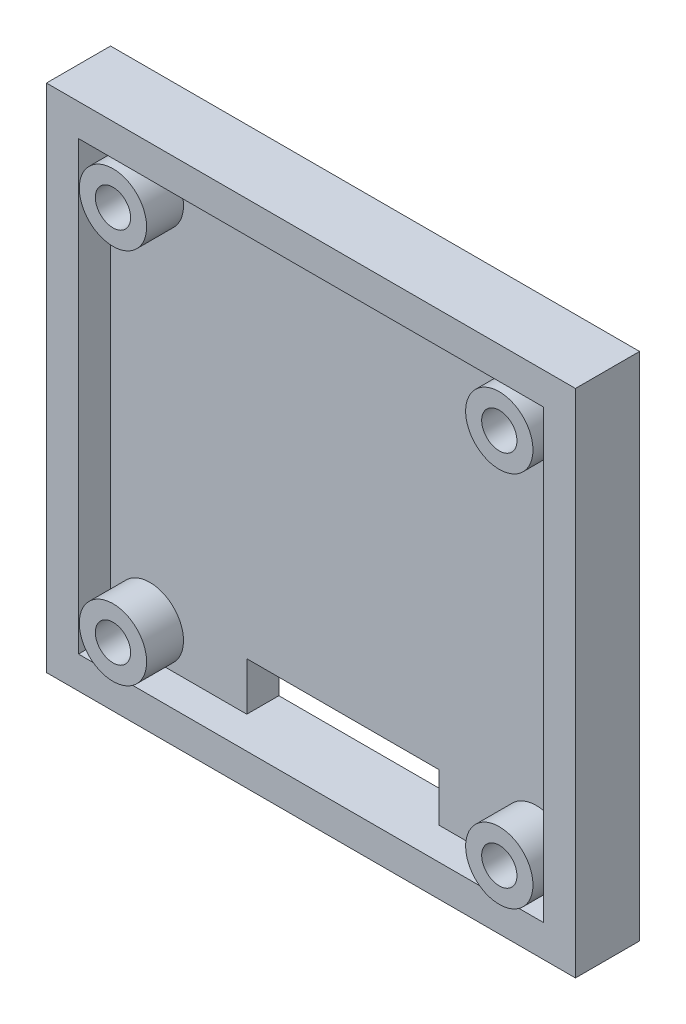
ISO-10303-21;
HEADER;
FILE_DESCRIPTION(('STEP AP214'),'2;1');
FILE_NAME('part.step','',(''),(''),'','','');
FILE_SCHEMA(('AUTOMOTIVE_DESIGN { 1 0 10303 214 1 1 1 1 }'));
ENDSEC;
DATA;
#1=APPLICATION_CONTEXT('core data for automotive mechanical design processes');
#2=APPLICATION_PROTOCOL_DEFINITION('international standard','automotive_design',2000,#1);
#3=PRODUCT_CONTEXT('',#1,'mechanical');
#4=PRODUCT('Part','Part','',(#3));
#5=PRODUCT_RELATED_PRODUCT_CATEGORY('part','',(#4));
#6=PRODUCT_DEFINITION_FORMATION('','',#4);
#7=PRODUCT_DEFINITION_CONTEXT('part definition',#1,'design');
#8=PRODUCT_DEFINITION('design','',#6,#7);
#9=PRODUCT_DEFINITION_SHAPE('','',#8);
#10=(LENGTH_UNIT() NAMED_UNIT(*) SI_UNIT(.MILLI.,.METRE.));
#11=(NAMED_UNIT(*) PLANE_ANGLE_UNIT() SI_UNIT($,.RADIAN.));
#12=(NAMED_UNIT(*) SI_UNIT($,.STERADIAN.) SOLID_ANGLE_UNIT());
#13=UNCERTAINTY_MEASURE_WITH_UNIT(LENGTH_MEASURE(1.E-05),#10,'distance_accuracy_value','');
#14=(GEOMETRIC_REPRESENTATION_CONTEXT(3) GLOBAL_UNCERTAINTY_ASSIGNED_CONTEXT((#13)) GLOBAL_UNIT_ASSIGNED_CONTEXT((#10,
#11,#12)) REPRESENTATION_CONTEXT('',''));
#15=CARTESIAN_POINT('',(0.,0.,0.));
#16=DIRECTION('',(0.,0.,1.));
#17=DIRECTION('',(1.,0.,0.));
#18=AXIS2_PLACEMENT_3D('',#15,#16,#17);
#19=CARTESIAN_POINT('',(0.,0.,2.));
#20=DIRECTION('',(0.,0.,1.));
#21=DIRECTION('',(1.,0.,0.));
#22=AXIS2_PLACEMENT_3D('',#19,#20,#21);
#23=PLANE('',#22);
#24=DIRECTION('',(1.,0.,0.));
#25=VECTOR('',#24,1.);
#26=CARTESIAN_POINT('',(-14.5,-13.925,2.));
#27=LINE('',#26,#25);
#28=CARTESIAN_POINT('',(6.,-13.925,2.));
#29=VERTEX_POINT('',#28);
#30=CARTESIAN_POINT('',(11.4096875762567,-13.925,2.));
#31=VERTEX_POINT('',#30);
#32=EDGE_CURVE('E443',#29,#31,#27,.T.);
#33=ORIENTED_EDGE('',*,*,#32,.T.);
#34=CARTESIAN_POINT('',(12.05,-11.925,2.));
#35=DIRECTION('',(0.,0.,1.));
#36=DIRECTION('',(1.,0.,0.));
#37=AXIS2_PLACEMENT_3D('',#34,#35,#36);
#38=CIRCLE('',#37,2.1);
#39=CARTESIAN_POINT('',(12.6903124237433,-13.925,2.));
#40=VERTEX_POINT('',#39);
#41=EDGE_CURVE('E290',#40,#31,#38,.T.);
#42=ORIENTED_EDGE('',*,*,#41,.F.);
#43=CARTESIAN_POINT('',(14.5,-13.925,2.));
#44=VERTEX_POINT('',#43);
#45=EDGE_CURVE('E228',#40,#44,#27,.T.);
#46=ORIENTED_EDGE('',*,*,#45,.T.);
#47=DIRECTION('',(0.,1.,0.));
#48=VECTOR('',#47,1.);
#49=CARTESIAN_POINT('',(14.5,13.925,2.));
#50=LINE('',#49,#48);
#51=CARTESIAN_POINT('',(14.5,13.925,2.));
#52=VERTEX_POINT('',#51);
#53=EDGE_CURVE('E233',#44,#52,#50,.T.);
#54=ORIENTED_EDGE('',*,*,#53,.T.);
#55=DIRECTION('',(-1.,0.,0.));
#56=VECTOR('',#55,1.);
#57=CARTESIAN_POINT('',(-14.5,13.925,2.));
#58=LINE('',#57,#56);
#59=CARTESIAN_POINT('',(-14.5,13.925,2.));
#60=VERTEX_POINT('',#59);
#61=EDGE_CURVE('E203',#52,#60,#58,.T.);
#62=ORIENTED_EDGE('',*,*,#61,.T.);
#63=DIRECTION('',(0.,-1.,0.));
#64=VECTOR('',#63,1.);
#65=CARTESIAN_POINT('',(-14.5,13.925,2.));
#66=LINE('',#65,#64);
#67=CARTESIAN_POINT('',(-14.5,-13.925,2.));
#68=VERTEX_POINT('',#67);
#69=EDGE_CURVE('E224',#60,#68,#66,.T.);
#70=ORIENTED_EDGE('',*,*,#69,.T.);
#71=CARTESIAN_POINT('',(-12.6903124237433,-13.925,2.));
#72=VERTEX_POINT('',#71);
#73=EDGE_CURVE('E229',#68,#72,#27,.T.);
#74=ORIENTED_EDGE('',*,*,#73,.T.);
#75=CARTESIAN_POINT('',(-12.05,-11.925,2.));
#76=DIRECTION('',(0.,0.,1.));
#77=DIRECTION('',(1.,0.,0.));
#78=AXIS2_PLACEMENT_3D('',#75,#76,#77);
#79=CIRCLE('',#78,2.1);
#80=CARTESIAN_POINT('',(-11.4096875762567,-13.925,2.));
#81=VERTEX_POINT('',#80);
#82=EDGE_CURVE('E301',#81,#72,#79,.T.);
#83=ORIENTED_EDGE('',*,*,#82,.F.);
#84=CARTESIAN_POINT('',(-6.,-13.925,2.));
#85=VERTEX_POINT('',#84);
#86=EDGE_CURVE('E234',#81,#85,#27,.T.);
#87=ORIENTED_EDGE('',*,*,#86,.T.);
#88=DIRECTION('',(0.,-1.,0.));
#89=VECTOR('',#88,1.);
#90=CARTESIAN_POINT('',(-6.,0.,2.));
#91=LINE('',#90,#89);
#92=CARTESIAN_POINT('',(-6.,-10.925,2.));
#93=VERTEX_POINT('',#92);
#94=EDGE_CURVE('E130',#93,#85,#91,.T.);
#95=ORIENTED_EDGE('',*,*,#94,.F.);
#96=DIRECTION('',(1.,0.,0.));
#97=VECTOR('',#96,1.);
#98=CARTESIAN_POINT('',(0.,-10.925,2.));
#99=LINE('',#98,#97);
#100=CARTESIAN_POINT('',(6.,-10.925,2.));
#101=VERTEX_POINT('',#100);
#102=EDGE_CURVE('E328',#93,#101,#99,.T.);
#103=ORIENTED_EDGE('',*,*,#102,.T.);
#104=DIRECTION('',(0.,-1.,0.));
#105=VECTOR('',#104,1.);
#106=CARTESIAN_POINT('',(6.,0.,2.));
#107=LINE('',#106,#105);
#108=EDGE_CURVE('E72',#101,#29,#107,.T.);
#109=ORIENTED_EDGE('',*,*,#108,.T.);
#110=EDGE_LOOP('',(#33,#42,#46,#54,#62,#70,#74,#83,#87,#95,#103,#109));
#111=FACE_BOUND('',#110,.T.);
#112=CARTESIAN_POINT('',(-12.05,11.575,2.));
#113=DIRECTION('',(0.,0.,1.));
#114=DIRECTION('',(1.,0.,0.));
#115=AXIS2_PLACEMENT_3D('',#112,#113,#114);
#116=CIRCLE('',#115,2.1);
#117=CARTESIAN_POINT('',(-9.95,11.575,2.));
#118=VERTEX_POINT('',#117);
#119=EDGE_CURVE('E316',#118,#118,#116,.T.);
#120=ORIENTED_EDGE('',*,*,#119,.F.);
#121=EDGE_LOOP('',(#120));
#122=FACE_BOUND('',#121,.T.);
#123=CARTESIAN_POINT('',(12.05,11.575,2.));
#124=DIRECTION('',(0.,0.,1.));
#125=DIRECTION('',(1.,0.,0.));
#126=AXIS2_PLACEMENT_3D('',#123,#124,#125);
#127=CIRCLE('',#126,2.1);
#128=CARTESIAN_POINT('',(14.15,11.575,2.));
#129=VERTEX_POINT('',#128);
#130=EDGE_CURVE('E278',#129,#129,#127,.T.);
#131=ORIENTED_EDGE('',*,*,#130,.F.);
#132=EDGE_LOOP('',(#131));
#133=FACE_BOUND('',#132,.T.);
#134=ADVANCED_FACE('F47',(#111,#122,#133),#23,.T.);
#135=CARTESIAN_POINT('',(-16.5,0.,2.));
#136=DIRECTION('',(-1.,0.,0.));
#137=DIRECTION('',(0.,0.,1.));
#138=AXIS2_PLACEMENT_3D('',#135,#136,#137);
#139=PLANE('',#138);
#140=DIRECTION('',(0.,1.,0.));
#141=VECTOR('',#140,1.);
#142=CARTESIAN_POINT('',(-16.5,0.,0.));
#143=LINE('',#142,#141);
#144=CARTESIAN_POINT('',(-16.5,-15.925,0.));
#145=VERTEX_POINT('',#144);
#146=CARTESIAN_POINT('',(-16.5,15.925,0.));
#147=VERTEX_POINT('',#146);
#148=EDGE_CURVE('E110',#145,#147,#143,.T.);
#149=ORIENTED_EDGE('',*,*,#148,.F.);
#150=DIRECTION('',(0.,0.,-1.));
#151=VECTOR('',#150,1.);
#152=CARTESIAN_POINT('',(-16.5,-15.925,2.));
#153=LINE('',#152,#151);
#154=CARTESIAN_POINT('',(-16.5,-15.925,4.));
#155=VERTEX_POINT('',#154);
#156=EDGE_CURVE('E154',#155,#145,#153,.T.);
#157=ORIENTED_EDGE('',*,*,#156,.F.);
#158=DIRECTION('',(0.,-1.,0.));
#159=VECTOR('',#158,1.);
#160=CARTESIAN_POINT('',(-16.5,15.925,4.));
#161=LINE('',#160,#159);
#162=CARTESIAN_POINT('',(-16.5,15.925,4.));
#163=VERTEX_POINT('',#162);
#164=EDGE_CURVE('E114',#163,#155,#161,.T.);
#165=ORIENTED_EDGE('',*,*,#164,.F.);
#166=DIRECTION('',(0.,0.,-1.));
#167=VECTOR('',#166,1.);
#168=CARTESIAN_POINT('',(-16.5,15.925,2.));
#169=LINE('',#168,#167);
#170=EDGE_CURVE('E105',#163,#147,#169,.T.);
#171=ORIENTED_EDGE('',*,*,#170,.T.);
#172=EDGE_LOOP('',(#149,#157,#165,#171));
#173=FACE_BOUND('',#172,.T.);
#174=ADVANCED_FACE('F107',(#173),#139,.T.);
#175=CARTESIAN_POINT('',(0.,-15.925,2.));
#176=DIRECTION('',(0.,-1.,0.));
#177=DIRECTION('',(1.,0.,0.));
#178=AXIS2_PLACEMENT_3D('',#175,#176,#177);
#179=PLANE('',#178);
#180=DIRECTION('',(-1.,0.,0.));
#181=VECTOR('',#180,1.);
#182=CARTESIAN_POINT('',(0.,-15.925,0.));
#183=LINE('',#182,#181);
#184=CARTESIAN_POINT('',(16.5,-15.925,0.));
#185=VERTEX_POINT('',#184);
#186=EDGE_CURVE('E135',#185,#145,#183,.T.);
#187=ORIENTED_EDGE('',*,*,#186,.F.);
#188=DIRECTION('',(0.,0.,-1.));
#189=VECTOR('',#188,1.);
#190=CARTESIAN_POINT('',(16.5,-15.925,2.));
#191=LINE('',#190,#189);
#192=CARTESIAN_POINT('',(16.5,-15.925,4.));
#193=VERTEX_POINT('',#192);
#194=EDGE_CURVE('E151',#193,#185,#191,.T.);
#195=ORIENTED_EDGE('',*,*,#194,.F.);
#196=DIRECTION('',(1.,0.,0.));
#197=VECTOR('',#196,1.);
#198=CARTESIAN_POINT('',(-16.5,-15.925,4.));
#199=LINE('',#198,#197);
#200=EDGE_CURVE('E256',#155,#193,#199,.T.);
#201=ORIENTED_EDGE('',*,*,#200,.F.);
#202=ORIENTED_EDGE('',*,*,#156,.T.);
#203=EDGE_LOOP('',(#187,#195,#201,#202));
#204=FACE_BOUND('',#203,.T.);
#205=ADVANCED_FACE('F391',(#204),#179,.T.);
#206=CARTESIAN_POINT('',(16.5,0.,2.));
#207=DIRECTION('',(-1.,0.,0.));
#208=DIRECTION('',(0.,-1.,0.));
#209=AXIS2_PLACEMENT_3D('',#206,#207,#208);
#210=PLANE('',#209);
#211=DIRECTION('',(0.,1.,0.));
#212=VECTOR('',#211,1.);
#213=CARTESIAN_POINT('',(16.5,0.,0.));
#214=LINE('',#213,#212);
#215=CARTESIAN_POINT('',(16.5,15.925,0.));
#216=VERTEX_POINT('',#215);
#217=EDGE_CURVE('E131',#185,#216,#214,.T.);
#218=ORIENTED_EDGE('',*,*,#217,.T.);
#219=DIRECTION('',(0.,0.,-1.));
#220=VECTOR('',#219,1.);
#221=CARTESIAN_POINT('',(16.5,15.925,2.));
#222=LINE('',#221,#220);
#223=CARTESIAN_POINT('',(16.5,15.925,4.));
#224=VERTEX_POINT('',#223);
#225=EDGE_CURVE('E119',#224,#216,#222,.T.);
#226=ORIENTED_EDGE('',*,*,#225,.F.);
#227=DIRECTION('',(0.,1.,0.));
#228=VECTOR('',#227,1.);
#229=CARTESIAN_POINT('',(16.5,15.925,4.));
#230=LINE('',#229,#228);
#231=EDGE_CURVE('E260',#193,#224,#230,.T.);
#232=ORIENTED_EDGE('',*,*,#231,.F.);
#233=ORIENTED_EDGE('',*,*,#194,.T.);
#234=EDGE_LOOP('',(#218,#226,#232,#233));
#235=FACE_BOUND('',#234,.T.);
#236=ADVANCED_FACE('F405',(#235),#210,.F.);
#237=CARTESIAN_POINT('',(-6.,0.,2.));
#238=DIRECTION('',(1.,0.,0.));
#239=DIRECTION('',(0.,1.,0.));
#240=AXIS2_PLACEMENT_3D('',#237,#238,#239);
#241=PLANE('',#240);
#242=DIRECTION('',(0.,-1.,0.));
#243=VECTOR('',#242,1.);
#244=CARTESIAN_POINT('',(-6.,0.,0.));
#245=LINE('',#244,#243);
#246=CARTESIAN_POINT('',(-6.,-10.925,0.));
#247=VERTEX_POINT('',#246);
#248=CARTESIAN_POINT('',(-6.,-13.925,0.));
#249=VERTEX_POINT('',#248);
#250=EDGE_CURVE('E336',#247,#249,#245,.T.);
#251=ORIENTED_EDGE('',*,*,#250,.F.);
#252=DIRECTION('',(0.,0.,-1.));
#253=VECTOR('',#252,1.);
#254=CARTESIAN_POINT('',(-6.,-10.925,2.));
#255=LINE('',#254,#253);
#256=EDGE_CURVE('E120',#93,#247,#255,.T.);
#257=ORIENTED_EDGE('',*,*,#256,.F.);
#258=ORIENTED_EDGE('',*,*,#94,.T.);
#259=DIRECTION('',(0.,0.,-1.));
#260=VECTOR('',#259,1.);
#261=CARTESIAN_POINT('',(-6.,-13.925,2.));
#262=LINE('',#261,#260);
#263=EDGE_CURVE('E158',#85,#249,#262,.T.);
#264=ORIENTED_EDGE('',*,*,#263,.T.);
#265=EDGE_LOOP('',(#251,#257,#258,#264));
#266=FACE_BOUND('',#265,.T.);
#267=ADVANCED_FACE('F408',(#266),#241,.T.);
#268=CARTESIAN_POINT('',(0.,-10.925,2.));
#269=DIRECTION('',(0.,1.,0.));
#270=DIRECTION('',(-1.,0.,0.));
#271=AXIS2_PLACEMENT_3D('',#268,#269,#270);
#272=PLANE('',#271);
#273=DIRECTION('',(1.,0.,0.));
#274=VECTOR('',#273,1.);
#275=CARTESIAN_POINT('',(0.,-10.925,0.));
#276=LINE('',#275,#274);
#277=CARTESIAN_POINT('',(6.,-10.925,0.));
#278=VERTEX_POINT('',#277);
#279=EDGE_CURVE('E340',#247,#278,#276,.T.);
#280=ORIENTED_EDGE('',*,*,#279,.T.);
#281=DIRECTION('',(0.,0.,-1.));
#282=VECTOR('',#281,1.);
#283=CARTESIAN_POINT('',(6.,-10.925,2.));
#284=LINE('',#283,#282);
#285=EDGE_CURVE('E164',#101,#278,#284,.T.);
#286=ORIENTED_EDGE('',*,*,#285,.F.);
#287=ORIENTED_EDGE('',*,*,#102,.F.);
#288=ORIENTED_EDGE('',*,*,#256,.T.);
#289=EDGE_LOOP('',(#280,#286,#287,#288));
#290=FACE_BOUND('',#289,.T.);
#291=ADVANCED_FACE('F425',(#290),#272,.F.);
#292=CARTESIAN_POINT('',(6.,0.,2.));
#293=DIRECTION('',(1.,0.,0.));
#294=DIRECTION('',(0.,0.,-1.));
#295=AXIS2_PLACEMENT_3D('',#292,#293,#294);
#296=PLANE('',#295);
#297=DIRECTION('',(0.,-1.,0.));
#298=VECTOR('',#297,1.);
#299=CARTESIAN_POINT('',(6.,0.,0.));
#300=LINE('',#299,#298);
#301=CARTESIAN_POINT('',(6.,-13.925,0.));
#302=VERTEX_POINT('',#301);
#303=EDGE_CURVE('E344',#278,#302,#300,.T.);
#304=ORIENTED_EDGE('',*,*,#303,.T.);
#305=DIRECTION('',(0.,0.,-1.));
#306=VECTOR('',#305,1.);
#307=CARTESIAN_POINT('',(6.,-13.925,2.));
#308=LINE('',#307,#306);
#309=EDGE_CURVE('E161',#29,#302,#308,.T.);
#310=ORIENTED_EDGE('',*,*,#309,.F.);
#311=ORIENTED_EDGE('',*,*,#108,.F.);
#312=ORIENTED_EDGE('',*,*,#285,.T.);
#313=EDGE_LOOP('',(#304,#310,#311,#312));
#314=FACE_BOUND('',#313,.T.);
#315=ADVANCED_FACE('F414',(#314),#296,.F.);
#316=CARTESIAN_POINT('',(-12.05,-11.925,2.));
#317=DIRECTION('',(0.,0.,-1.));
#318=DIRECTION('',(-1.,0.,0.));
#319=AXIS2_PLACEMENT_3D('',#316,#317,#318);
#320=CYLINDRICAL_SURFACE('',#319,1.1);
#321=CARTESIAN_POINT('',(-12.05,-11.925,0.));
#322=DIRECTION('',(0.,0.,1.));
#323=DIRECTION('',(1.,0.,0.));
#324=AXIS2_PLACEMENT_3D('',#321,#322,#323);
#325=CIRCLE('',#324,1.1);
#326=CARTESIAN_POINT('',(-10.95,-11.925,0.));
#327=VERTEX_POINT('',#326);
#328=EDGE_CURVE('E137',#327,#327,#325,.T.);
#329=ORIENTED_EDGE('',*,*,#328,.F.);
#330=EDGE_LOOP('',(#329));
#331=FACE_BOUND('',#330,.T.);
#332=CARTESIAN_POINT('',(-12.05,-11.925,4.3));
#333=DIRECTION('',(0.,0.,1.));
#334=DIRECTION('',(1.,0.,0.));
#335=AXIS2_PLACEMENT_3D('',#332,#333,#334);
#336=CIRCLE('',#335,1.1);
#337=CARTESIAN_POINT('',(-10.95,-11.925,4.3));
#338=VERTEX_POINT('',#337);
#339=EDGE_CURVE('E305',#338,#338,#336,.T.);
#340=ORIENTED_EDGE('',*,*,#339,.T.);
#341=EDGE_LOOP('',(#340));
#342=FACE_BOUND('',#341,.T.);
#343=ADVANCED_FACE('F365',(#331,#342),#320,.F.);
#344=CARTESIAN_POINT('',(12.05,11.575,2.));
#345=DIRECTION('',(0.,0.,-1.));
#346=DIRECTION('',(-1.,0.,0.));
#347=AXIS2_PLACEMENT_3D('',#344,#345,#346);
#348=CYLINDRICAL_SURFACE('',#347,1.1);
#349=CARTESIAN_POINT('',(12.05,11.575,0.));
#350=DIRECTION('',(0.,0.,1.));
#351=DIRECTION('',(1.,0.,0.));
#352=AXIS2_PLACEMENT_3D('',#349,#350,#351);
#353=CIRCLE('',#352,1.1);
#354=CARTESIAN_POINT('',(13.15,11.575,0.));
#355=VERTEX_POINT('',#354);
#356=EDGE_CURVE('E143',#355,#355,#353,.T.);
#357=ORIENTED_EDGE('',*,*,#356,.F.);
#358=EDGE_LOOP('',(#357));
#359=FACE_BOUND('',#358,.T.);
#360=CARTESIAN_POINT('',(12.05,11.575,4.3));
#361=DIRECTION('',(0.,0.,1.));
#362=DIRECTION('',(1.,0.,0.));
#363=AXIS2_PLACEMENT_3D('',#360,#361,#362);
#364=CIRCLE('',#363,1.1);
#365=CARTESIAN_POINT('',(13.15,11.575,4.3));
#366=VERTEX_POINT('',#365);
#367=EDGE_CURVE('E282',#366,#366,#364,.T.);
#368=ORIENTED_EDGE('',*,*,#367,.T.);
#369=EDGE_LOOP('',(#368));
#370=FACE_BOUND('',#369,.T.);
#371=ADVANCED_FACE('F361',(#359,#370),#348,.F.);
#372=CARTESIAN_POINT('',(-12.05,11.575,2.));
#373=DIRECTION('',(0.,0.,-1.));
#374=DIRECTION('',(-1.,0.,0.));
#375=AXIS2_PLACEMENT_3D('',#372,#373,#374);
#376=CYLINDRICAL_SURFACE('',#375,1.1);
#377=CARTESIAN_POINT('',(-12.05,11.575,0.));
#378=DIRECTION('',(0.,0.,1.));
#379=DIRECTION('',(1.,0.,0.));
#380=AXIS2_PLACEMENT_3D('',#377,#378,#379);
#381=CIRCLE('',#380,1.1);
#382=CARTESIAN_POINT('',(-10.95,11.575,0.));
#383=VERTEX_POINT('',#382);
#384=EDGE_CURVE('E352',#383,#383,#381,.T.);
#385=ORIENTED_EDGE('',*,*,#384,.F.);
#386=EDGE_LOOP('',(#385));
#387=FACE_BOUND('',#386,.T.);
#388=CARTESIAN_POINT('',(-12.05,11.575,4.3));
#389=DIRECTION('',(0.,0.,1.));
#390=DIRECTION('',(1.,0.,0.));
#391=AXIS2_PLACEMENT_3D('',#388,#389,#390);
#392=CIRCLE('',#391,1.1);
#393=CARTESIAN_POINT('',(-10.95,11.575,4.3));
#394=VERTEX_POINT('',#393);
#395=EDGE_CURVE('E312',#394,#394,#392,.T.);
#396=ORIENTED_EDGE('',*,*,#395,.T.);
#397=EDGE_LOOP('',(#396));
#398=FACE_BOUND('',#397,.T.);
#399=ADVANCED_FACE('F364',(#387,#398),#376,.F.);
#400=CARTESIAN_POINT('',(0.,-13.925,2.));
#401=DIRECTION('',(0.,1.,0.));
#402=DIRECTION('',(0.,0.,1.));
#403=AXIS2_PLACEMENT_3D('',#400,#401,#402);
#404=PLANE('',#403);
#405=DIRECTION('',(1.,0.,0.));
#406=VECTOR('',#405,1.);
#407=CARTESIAN_POINT('',(0.,-13.925,0.));
#408=LINE('',#407,#406);
#409=EDGE_CURVE('E348',#249,#302,#408,.T.);
#410=ORIENTED_EDGE('',*,*,#409,.F.);
#411=ORIENTED_EDGE('',*,*,#263,.F.);
#412=ORIENTED_EDGE('',*,*,#86,.F.);
#413=DIRECTION('',(0.,0.,-1.));
#414=VECTOR('',#413,1.);
#415=CARTESIAN_POINT('',(-11.4096875762567,-13.925,4.3));
#416=LINE('',#415,#414);
#417=CARTESIAN_POINT('',(-11.4096875762567,-13.925,4.));
#418=VERTEX_POINT('',#417);
#419=EDGE_CURVE('E270',#418,#81,#416,.T.);
#420=ORIENTED_EDGE('',*,*,#419,.F.);
#421=DIRECTION('',(1.,0.,0.));
#422=VECTOR('',#421,1.);
#423=CARTESIAN_POINT('',(-14.5,-13.925,4.));
#424=LINE('',#423,#422);
#425=CARTESIAN_POINT('',(11.4096875762567,-13.925,4.));
#426=VERTEX_POINT('',#425);
#427=EDGE_CURVE('E63',#418,#426,#424,.T.);
#428=ORIENTED_EDGE('',*,*,#427,.T.);
#429=DIRECTION('',(0.,0.,-1.));
#430=VECTOR('',#429,1.);
#431=CARTESIAN_POINT('',(11.4096875762567,-13.925,4.3));
#432=LINE('',#431,#430);
#433=EDGE_CURVE('E157',#31,#426,#432,.F.);
#434=ORIENTED_EDGE('',*,*,#433,.F.);
#435=ORIENTED_EDGE('',*,*,#32,.F.);
#436=ORIENTED_EDGE('',*,*,#309,.T.);
#437=EDGE_LOOP('',(#410,#411,#412,#420,#428,#434,#435,#436));
#438=FACE_BOUND('',#437,.T.);
#439=ADVANCED_FACE('F419',(#438),#404,.T.);
#440=CARTESIAN_POINT('',(12.05,-11.925,2.));
#441=DIRECTION('',(0.,0.,-1.));
#442=DIRECTION('',(-1.,0.,0.));
#443=AXIS2_PLACEMENT_3D('',#440,#441,#442);
#444=CYLINDRICAL_SURFACE('',#443,1.1);
#445=CARTESIAN_POINT('',(12.05,-11.925,0.));
#446=DIRECTION('',(0.,0.,1.));
#447=DIRECTION('',(1.,0.,0.));
#448=AXIS2_PLACEMENT_3D('',#445,#446,#447);
#449=CIRCLE('',#448,1.1);
#450=CARTESIAN_POINT('',(13.15,-11.925,0.));
#451=VERTEX_POINT('',#450);
#452=EDGE_CURVE('E321',#451,#451,#449,.T.);
#453=ORIENTED_EDGE('',*,*,#452,.F.);
#454=EDGE_LOOP('',(#453));
#455=FACE_BOUND('',#454,.T.);
#456=CARTESIAN_POINT('',(12.05,-11.925,4.3));
#457=DIRECTION('',(0.,0.,1.));
#458=DIRECTION('',(1.,0.,0.));
#459=AXIS2_PLACEMENT_3D('',#456,#457,#458);
#460=CIRCLE('',#459,1.1);
#461=CARTESIAN_POINT('',(13.15,-11.925,4.3));
#462=VERTEX_POINT('',#461);
#463=EDGE_CURVE('E293',#462,#462,#460,.T.);
#464=ORIENTED_EDGE('',*,*,#463,.T.);
#465=EDGE_LOOP('',(#464));
#466=FACE_BOUND('',#465,.T.);
#467=ADVANCED_FACE('F49',(#455,#466),#444,.F.);
#468=CARTESIAN_POINT('',(0.,15.925,2.));
#469=DIRECTION('',(0.,-1.,0.));
#470=DIRECTION('',(1.,0.,0.));
#471=AXIS2_PLACEMENT_3D('',#468,#469,#470);
#472=PLANE('',#471);
#473=DIRECTION('',(-1.,0.,0.));
#474=VECTOR('',#473,1.);
#475=CARTESIAN_POINT('',(0.,15.925,0.));
#476=LINE('',#475,#474);
#477=EDGE_CURVE('E123',#216,#147,#476,.T.);
#478=ORIENTED_EDGE('',*,*,#477,.T.);
#479=ORIENTED_EDGE('',*,*,#170,.F.);
#480=DIRECTION('',(-1.,0.,0.));
#481=VECTOR('',#480,1.);
#482=CARTESIAN_POINT('',(-16.5,15.925,4.));
#483=LINE('',#482,#481);
#484=EDGE_CURVE('E264',#224,#163,#483,.T.);
#485=ORIENTED_EDGE('',*,*,#484,.F.);
#486=ORIENTED_EDGE('',*,*,#225,.T.);
#487=EDGE_LOOP('',(#478,#479,#485,#486));
#488=FACE_BOUND('',#487,.T.);
#489=ADVANCED_FACE('F124',(#488),#472,.F.);
#490=CARTESIAN_POINT('',(0.,0.,0.));
#491=DIRECTION('',(0.,0.,1.));
#492=DIRECTION('',(1.,0.,0.));
#493=AXIS2_PLACEMENT_3D('',#490,#491,#492);
#494=PLANE('',#493);
#495=ORIENTED_EDGE('',*,*,#452,.T.);
#496=EDGE_LOOP('',(#495));
#497=FACE_BOUND('',#496,.T.);
#498=ORIENTED_EDGE('',*,*,#250,.T.);
#499=ORIENTED_EDGE('',*,*,#409,.T.);
#500=ORIENTED_EDGE('',*,*,#303,.F.);
#501=ORIENTED_EDGE('',*,*,#279,.F.);
#502=EDGE_LOOP('',(#498,#499,#500,#501));
#503=FACE_BOUND('',#502,.T.);
#504=ORIENTED_EDGE('',*,*,#384,.T.);
#505=EDGE_LOOP('',(#504));
#506=FACE_BOUND('',#505,.T.);
#507=ORIENTED_EDGE('',*,*,#356,.T.);
#508=EDGE_LOOP('',(#507));
#509=FACE_BOUND('',#508,.T.);
#510=ORIENTED_EDGE('',*,*,#328,.T.);
#511=EDGE_LOOP('',(#510));
#512=FACE_BOUND('',#511,.T.);
#513=ORIENTED_EDGE('',*,*,#148,.T.);
#514=ORIENTED_EDGE('',*,*,#477,.F.);
#515=ORIENTED_EDGE('',*,*,#217,.F.);
#516=ORIENTED_EDGE('',*,*,#186,.T.);
#517=EDGE_LOOP('',(#513,#514,#515,#516));
#518=FACE_BOUND('',#517,.T.);
#519=ADVANCED_FACE('F133',(#497,#503,#506,#509,#512,#518),#494,.F.);
#520=CARTESIAN_POINT('',(-12.05,11.575,4.3));
#521=DIRECTION('',(0.,0.,1.));
#522=DIRECTION('',(1.,0.,0.));
#523=AXIS2_PLACEMENT_3D('',#520,#521,#522);
#524=PLANE('',#523);
#525=CARTESIAN_POINT('',(-12.05,11.575,4.3));
#526=DIRECTION('',(0.,0.,1.));
#527=DIRECTION('',(1.,0.,0.));
#528=AXIS2_PLACEMENT_3D('',#525,#526,#527);
#529=CIRCLE('',#528,2.1);
#530=CARTESIAN_POINT('',(-9.95,11.575,4.3));
#531=VERTEX_POINT('',#530);
#532=EDGE_CURVE('E317',#531,#531,#529,.T.);
#533=ORIENTED_EDGE('',*,*,#532,.T.);
#534=EDGE_LOOP('',(#533));
#535=FACE_BOUND('',#534,.T.);
#536=ORIENTED_EDGE('',*,*,#395,.F.);
#537=EDGE_LOOP('',(#536));
#538=FACE_BOUND('',#537,.T.);
#539=ADVANCED_FACE('F401',(#535,#538),#524,.T.);
#540=CARTESIAN_POINT('',(-12.05,11.575,4.3));
#541=DIRECTION('',(0.,0.,-1.));
#542=DIRECTION('',(-1.,0.,0.));
#543=AXIS2_PLACEMENT_3D('',#540,#541,#542);
#544=CYLINDRICAL_SURFACE('',#543,2.1);
#545=ORIENTED_EDGE('',*,*,#532,.F.);
#546=EDGE_LOOP('',(#545));
#547=FACE_BOUND('',#546,.T.);
#548=ORIENTED_EDGE('',*,*,#119,.T.);
#549=EDGE_LOOP('',(#548));
#550=FACE_BOUND('',#549,.T.);
#551=ADVANCED_FACE('F397',(#547,#550),#544,.T.);
#552=CARTESIAN_POINT('',(-12.05,-11.925,4.3));
#553=DIRECTION('',(0.,0.,1.));
#554=DIRECTION('',(1.,0.,0.));
#555=AXIS2_PLACEMENT_3D('',#552,#553,#554);
#556=PLANE('',#555);
#557=CARTESIAN_POINT('',(-12.05,-11.925,4.3));
#558=DIRECTION('',(0.,0.,1.));
#559=DIRECTION('',(1.,0.,0.));
#560=AXIS2_PLACEMENT_3D('',#557,#558,#559);
#561=CIRCLE('',#560,2.1);
#562=CARTESIAN_POINT('',(-9.95,-11.925,4.3));
#563=VERTEX_POINT('',#562);
#564=EDGE_CURVE('E300',#563,#563,#561,.T.);
#565=ORIENTED_EDGE('',*,*,#564,.T.);
#566=EDGE_LOOP('',(#565));
#567=FACE_BOUND('',#566,.T.);
#568=ORIENTED_EDGE('',*,*,#339,.F.);
#569=EDGE_LOOP('',(#568));
#570=FACE_BOUND('',#569,.T.);
#571=ADVANCED_FACE('F622',(#567,#570),#556,.T.);
#572=CARTESIAN_POINT('',(-12.05,-11.925,4.3));
#573=DIRECTION('',(0.,0.,-1.));
#574=DIRECTION('',(-1.,0.,0.));
#575=AXIS2_PLACEMENT_3D('',#572,#573,#574);
#576=CYLINDRICAL_SURFACE('',#575,2.1);
#577=ORIENTED_EDGE('',*,*,#564,.F.);
#578=EDGE_LOOP('',(#577));
#579=FACE_BOUND('',#578,.T.);
#580=CARTESIAN_POINT('',(-12.05,-11.925,4.));
#581=DIRECTION('',(0.,0.,1.));
#582=DIRECTION('',(1.,0.,0.));
#583=AXIS2_PLACEMENT_3D('',#580,#581,#582);
#584=CIRCLE('',#583,2.1);
#585=CARTESIAN_POINT('',(-12.6903124237433,-13.925,4.));
#586=VERTEX_POINT('',#585);
#587=EDGE_CURVE('E274',#586,#418,#584,.T.);
#588=ORIENTED_EDGE('',*,*,#587,.T.);
#589=ORIENTED_EDGE('',*,*,#419,.T.);
#590=ORIENTED_EDGE('',*,*,#82,.T.);
#591=DIRECTION('',(0.,0.,-1.));
#592=VECTOR('',#591,1.);
#593=CARTESIAN_POINT('',(-12.6903124237433,-13.925,4.3));
#594=LINE('',#593,#592);
#595=EDGE_CURVE('E267',#72,#586,#594,.F.);
#596=ORIENTED_EDGE('',*,*,#595,.T.);
#597=EDGE_LOOP('',(#588,#589,#590,#596));
#598=FACE_BOUND('',#597,.T.);
#599=ADVANCED_FACE('F461',(#579,#598),#576,.T.);
#600=CARTESIAN_POINT('',(12.05,-11.925,4.3));
#601=DIRECTION('',(0.,0.,1.));
#602=DIRECTION('',(1.,0.,0.));
#603=AXIS2_PLACEMENT_3D('',#600,#601,#602);
#604=PLANE('',#603);
#605=CARTESIAN_POINT('',(12.05,-11.925,4.3));
#606=DIRECTION('',(0.,0.,1.));
#607=DIRECTION('',(1.,0.,0.));
#608=AXIS2_PLACEMENT_3D('',#605,#606,#607);
#609=CIRCLE('',#608,2.1);
#610=CARTESIAN_POINT('',(14.15,-11.925,4.3));
#611=VERTEX_POINT('',#610);
#612=EDGE_CURVE('E289',#611,#611,#609,.T.);
#613=ORIENTED_EDGE('',*,*,#612,.T.);
#614=EDGE_LOOP('',(#613));
#615=FACE_BOUND('',#614,.T.);
#616=ORIENTED_EDGE('',*,*,#463,.F.);
#617=EDGE_LOOP('',(#616));
#618=FACE_BOUND('',#617,.T.);
#619=ADVANCED_FACE('F382',(#615,#618),#604,.T.);
#620=CARTESIAN_POINT('',(12.05,-11.925,4.3));
#621=DIRECTION('',(0.,0.,-1.));
#622=DIRECTION('',(-1.,0.,0.));
#623=AXIS2_PLACEMENT_3D('',#620,#621,#622);
#624=CYLINDRICAL_SURFACE('',#623,2.1);
#625=ORIENTED_EDGE('',*,*,#612,.F.);
#626=EDGE_LOOP('',(#625));
#627=FACE_BOUND('',#626,.T.);
#628=CARTESIAN_POINT('',(12.05,-11.925,4.));
#629=DIRECTION('',(0.,0.,1.));
#630=DIRECTION('',(1.,0.,0.));
#631=AXIS2_PLACEMENT_3D('',#628,#629,#630);
#632=CIRCLE('',#631,2.1);
#633=CARTESIAN_POINT('',(12.6903124237433,-13.925,4.));
#634=VERTEX_POINT('',#633);
#635=EDGE_CURVE('E56',#426,#634,#632,.T.);
#636=ORIENTED_EDGE('',*,*,#635,.T.);
#637=DIRECTION('',(0.,0.,-1.));
#638=VECTOR('',#637,1.);
#639=CARTESIAN_POINT('',(12.6903124237433,-13.925,4.3));
#640=LINE('',#639,#638);
#641=EDGE_CURVE('E11',#634,#40,#640,.T.);
#642=ORIENTED_EDGE('',*,*,#641,.T.);
#643=ORIENTED_EDGE('',*,*,#41,.T.);
#644=ORIENTED_EDGE('',*,*,#433,.T.);
#645=EDGE_LOOP('',(#636,#642,#643,#644));
#646=FACE_BOUND('',#645,.T.);
#647=ADVANCED_FACE('F174',(#627,#646),#624,.T.);
#648=CARTESIAN_POINT('',(12.05,11.575,4.3));
#649=DIRECTION('',(0.,0.,1.));
#650=DIRECTION('',(1.,0.,0.));
#651=AXIS2_PLACEMENT_3D('',#648,#649,#650);
#652=PLANE('',#651);
#653=CARTESIAN_POINT('',(12.05,11.575,4.3));
#654=DIRECTION('',(0.,0.,1.));
#655=DIRECTION('',(1.,0.,0.));
#656=AXIS2_PLACEMENT_3D('',#653,#654,#655);
#657=CIRCLE('',#656,2.1);
#658=CARTESIAN_POINT('',(14.15,11.575,4.3));
#659=VERTEX_POINT('',#658);
#660=EDGE_CURVE('E277',#659,#659,#657,.T.);
#661=ORIENTED_EDGE('',*,*,#660,.T.);
#662=EDGE_LOOP('',(#661));
#663=FACE_BOUND('',#662,.T.);
#664=ORIENTED_EDGE('',*,*,#367,.F.);
#665=EDGE_LOOP('',(#664));
#666=FACE_BOUND('',#665,.T.);
#667=ADVANCED_FACE('F369',(#663,#666),#652,.T.);
#668=CARTESIAN_POINT('',(12.05,11.575,4.3));
#669=DIRECTION('',(0.,0.,-1.));
#670=DIRECTION('',(-1.,0.,0.));
#671=AXIS2_PLACEMENT_3D('',#668,#669,#670);
#672=CYLINDRICAL_SURFACE('',#671,2.1);
#673=ORIENTED_EDGE('',*,*,#660,.F.);
#674=EDGE_LOOP('',(#673));
#675=FACE_BOUND('',#674,.T.);
#676=ORIENTED_EDGE('',*,*,#130,.T.);
#677=EDGE_LOOP('',(#676));
#678=FACE_BOUND('',#677,.T.);
#679=ADVANCED_FACE('F371',(#675,#678),#672,.T.);
#680=CARTESIAN_POINT('',(-14.5,-13.925,4.));
#681=DIRECTION('',(0.,1.,0.));
#682=DIRECTION('',(0.,0.,1.));
#683=AXIS2_PLACEMENT_3D('',#680,#681,#682);
#684=PLANE('',#683);
#685=ORIENTED_EDGE('',*,*,#595,.F.);
#686=ORIENTED_EDGE('',*,*,#73,.F.);
#687=DIRECTION('',(0.,0.,-1.));
#688=VECTOR('',#687,1.);
#689=CARTESIAN_POINT('',(-14.5,-13.925,4.));
#690=LINE('',#689,#688);
#691=CARTESIAN_POINT('',(-14.5,-13.925,4.));
#692=VERTEX_POINT('',#691);
#693=EDGE_CURVE('E250',#692,#68,#690,.T.);
#694=ORIENTED_EDGE('',*,*,#693,.F.);
#695=EDGE_CURVE('E199',#692,#586,#424,.T.);
#696=ORIENTED_EDGE('',*,*,#695,.T.);
#697=EDGE_LOOP('',(#685,#686,#694,#696));
#698=FACE_BOUND('',#697,.T.);
#699=ADVANCED_FACE('F378',(#698),#684,.T.);
#700=ORIENTED_EDGE('',*,*,#641,.F.);
#701=CARTESIAN_POINT('',(14.5,-13.925,4.));
#702=VERTEX_POINT('',#701);
#703=EDGE_CURVE('E188',#634,#702,#424,.T.);
#704=ORIENTED_EDGE('',*,*,#703,.T.);
#705=DIRECTION('',(0.,0.,-1.));
#706=VECTOR('',#705,1.);
#707=CARTESIAN_POINT('',(14.5,-13.925,4.));
#708=LINE('',#707,#706);
#709=EDGE_CURVE('E247',#702,#44,#708,.T.);
#710=ORIENTED_EDGE('',*,*,#709,.T.);
#711=ORIENTED_EDGE('',*,*,#45,.F.);
#712=EDGE_LOOP('',(#700,#704,#710,#711));
#713=FACE_BOUND('',#712,.T.);
#714=ADVANCED_FACE('F500',(#713),#684,.T.);
#715=CARTESIAN_POINT('',(0.,0.,4.));
#716=DIRECTION('',(0.,0.,1.));
#717=DIRECTION('',(1.,0.,0.));
#718=AXIS2_PLACEMENT_3D('',#715,#716,#717);
#719=PLANE('',#718);
#720=ORIENTED_EDGE('',*,*,#587,.F.);
#721=ORIENTED_EDGE('',*,*,#695,.F.);
#722=DIRECTION('',(0.,-1.,0.));
#723=VECTOR('',#722,1.);
#724=CARTESIAN_POINT('',(-14.5,13.925,4.));
#725=LINE('',#724,#723);
#726=CARTESIAN_POINT('',(-14.5,13.925,4.));
#727=VERTEX_POINT('',#726);
#728=EDGE_CURVE('E197',#727,#692,#725,.T.);
#729=ORIENTED_EDGE('',*,*,#728,.F.);
#730=DIRECTION('',(-1.,0.,0.));
#731=VECTOR('',#730,1.);
#732=CARTESIAN_POINT('',(-14.5,13.925,4.));
#733=LINE('',#732,#731);
#734=CARTESIAN_POINT('',(14.5,13.925,4.));
#735=VERTEX_POINT('',#734);
#736=EDGE_CURVE('E215',#735,#727,#733,.T.);
#737=ORIENTED_EDGE('',*,*,#736,.F.);
#738=DIRECTION('',(0.,1.,0.));
#739=VECTOR('',#738,1.);
#740=CARTESIAN_POINT('',(14.5,13.925,4.));
#741=LINE('',#740,#739);
#742=EDGE_CURVE('E192',#702,#735,#741,.T.);
#743=ORIENTED_EDGE('',*,*,#742,.F.);
#744=ORIENTED_EDGE('',*,*,#703,.F.);
#745=ORIENTED_EDGE('',*,*,#635,.F.);
#746=ORIENTED_EDGE('',*,*,#427,.F.);
#747=EDGE_LOOP('',(#720,#721,#729,#737,#743,#744,#745,#746));
#748=FACE_BOUND('',#747,.T.);
#749=ORIENTED_EDGE('',*,*,#164,.T.);
#750=ORIENTED_EDGE('',*,*,#200,.T.);
#751=ORIENTED_EDGE('',*,*,#231,.T.);
#752=ORIENTED_EDGE('',*,*,#484,.T.);
#753=EDGE_LOOP('',(#749,#750,#751,#752));
#754=FACE_BOUND('',#753,.T.);
#755=ADVANCED_FACE('F183',(#748,#754),#719,.T.);
#756=CARTESIAN_POINT('',(-14.5,13.925,4.));
#757=DIRECTION('',(1.,0.,0.));
#758=DIRECTION('',(0.,1.,0.));
#759=AXIS2_PLACEMENT_3D('',#756,#757,#758);
#760=PLANE('',#759);
#761=ORIENTED_EDGE('',*,*,#69,.F.);
#762=DIRECTION('',(0.,0.,-1.));
#763=VECTOR('',#762,1.);
#764=CARTESIAN_POINT('',(-14.5,13.925,4.));
#765=LINE('',#764,#763);
#766=EDGE_CURVE('E221',#727,#60,#765,.T.);
#767=ORIENTED_EDGE('',*,*,#766,.F.);
#768=ORIENTED_EDGE('',*,*,#728,.T.);
#769=ORIENTED_EDGE('',*,*,#693,.T.);
#770=EDGE_LOOP('',(#761,#767,#768,#769));
#771=FACE_BOUND('',#770,.T.);
#772=ADVANCED_FACE('F469',(#771),#760,.T.);
#773=CARTESIAN_POINT('',(14.5,13.925,4.));
#774=DIRECTION('',(-1.,0.,0.));
#775=DIRECTION('',(0.,-1.,0.));
#776=AXIS2_PLACEMENT_3D('',#773,#774,#775);
#777=PLANE('',#776);
#778=ORIENTED_EDGE('',*,*,#53,.F.);
#779=ORIENTED_EDGE('',*,*,#709,.F.);
#780=ORIENTED_EDGE('',*,*,#742,.T.);
#781=DIRECTION('',(0.,0.,-1.));
#782=VECTOR('',#781,1.);
#783=CARTESIAN_POINT('',(14.5,13.925,4.));
#784=LINE('',#783,#782);
#785=EDGE_CURVE('E244',#735,#52,#784,.T.);
#786=ORIENTED_EDGE('',*,*,#785,.T.);
#787=EDGE_LOOP('',(#778,#779,#780,#786));
#788=FACE_BOUND('',#787,.T.);
#789=ADVANCED_FACE('F495',(#788),#777,.T.);
#790=CARTESIAN_POINT('',(-14.5,13.925,4.));
#791=DIRECTION('',(0.,-1.,0.));
#792=DIRECTION('',(0.,0.,-1.));
#793=AXIS2_PLACEMENT_3D('',#790,#791,#792);
#794=PLANE('',#793);
#795=ORIENTED_EDGE('',*,*,#61,.F.);
#796=ORIENTED_EDGE('',*,*,#785,.F.);
#797=ORIENTED_EDGE('',*,*,#736,.T.);
#798=ORIENTED_EDGE('',*,*,#766,.T.);
#799=EDGE_LOOP('',(#795,#796,#797,#798));
#800=FACE_BOUND('',#799,.T.);
#801=ADVANCED_FACE('F493',(#800),#794,.T.);
#802=CLOSED_SHELL('',(#134,#174,#205,#236,#267,#291,#315,#343,#371,#399,#439,#467,#489,#519,
#539,#551,#571,#599,#619,#647,#667,#679,#699,#714,#755,#772,#789,#801));
#803=MANIFOLD_SOLID_BREP('B2',#802);
#804=ADVANCED_BREP_SHAPE_REPRESENTATION('',(#18,#803),#14);
#805=SHAPE_DEFINITION_REPRESENTATION(#9,#804);
ENDSEC;
END-ISO-10303-21;
